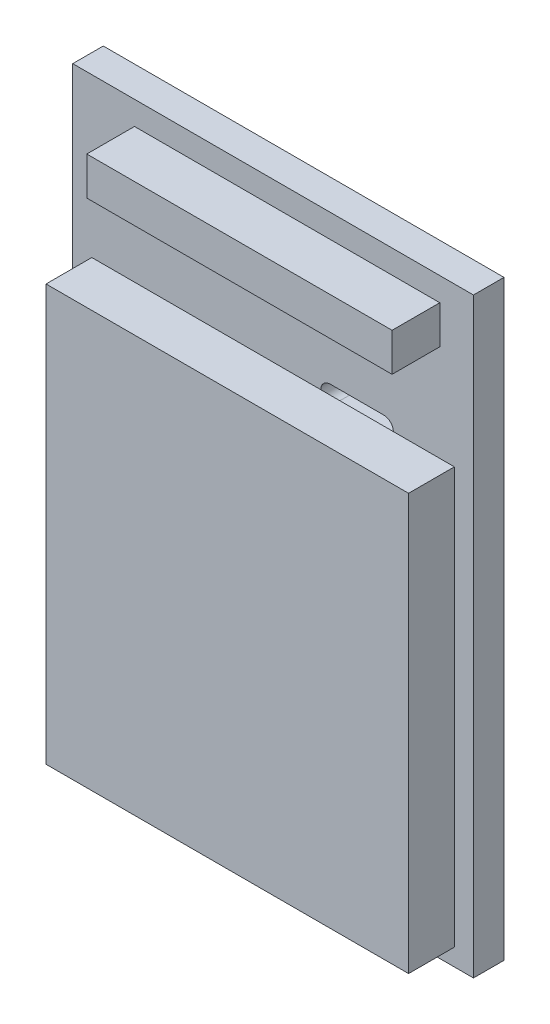
ISO-10303-21;
HEADER;
FILE_DESCRIPTION(('STEP AP214'),'2;1');
FILE_NAME('part.step','',(''),(''),'','','');
FILE_SCHEMA(('AUTOMOTIVE_DESIGN { 1 0 10303 214 1 1 1 1 }'));
ENDSEC;
DATA;
#1=APPLICATION_CONTEXT('core data for automotive mechanical design processes');
#2=APPLICATION_PROTOCOL_DEFINITION('international standard','automotive_design',2000,#1);
#3=PRODUCT_CONTEXT('',#1,'mechanical');
#4=PRODUCT('Part','Part','',(#3));
#5=PRODUCT_RELATED_PRODUCT_CATEGORY('part','',(#4));
#6=PRODUCT_DEFINITION_FORMATION('','',#4);
#7=PRODUCT_DEFINITION_CONTEXT('part definition',#1,'design');
#8=PRODUCT_DEFINITION('design','',#6,#7);
#9=PRODUCT_DEFINITION_SHAPE('','',#8);
#10=(LENGTH_UNIT() NAMED_UNIT(*) SI_UNIT(.MILLI.,.METRE.));
#11=(NAMED_UNIT(*) PLANE_ANGLE_UNIT() SI_UNIT($,.RADIAN.));
#12=(NAMED_UNIT(*) SI_UNIT($,.STERADIAN.) SOLID_ANGLE_UNIT());
#13=UNCERTAINTY_MEASURE_WITH_UNIT(LENGTH_MEASURE(1.E-05),#10,'distance_accuracy_value','');
#14=(GEOMETRIC_REPRESENTATION_CONTEXT(3) GLOBAL_UNCERTAINTY_ASSIGNED_CONTEXT((#13)) GLOBAL_UNIT_ASSIGNED_CONTEXT((#10,
#11,#12)) REPRESENTATION_CONTEXT('',''));
#15=CARTESIAN_POINT('',(0.,0.,0.));
#16=DIRECTION('',(0.,0.,1.));
#17=DIRECTION('',(1.,0.,0.));
#18=AXIS2_PLACEMENT_3D('',#15,#16,#17);
#19=CARTESIAN_POINT('',(-4.75,3.6,0.8));
#20=DIRECTION('',(-1.,0.,0.));
#21=DIRECTION('',(0.,1.,0.));
#22=AXIS2_PLACEMENT_3D('',#19,#20,#21);
#23=PLANE('',#22);
#24=DIRECTION('',(0.,-1.,0.));
#25=VECTOR('',#24,1.);
#26=CARTESIAN_POINT('',(-4.75,3.6,0.8));
#27=LINE('',#26,#25);
#28=CARTESIAN_POINT('',(-4.75,3.6,0.8));
#29=VERTEX_POINT('',#28);
#30=CARTESIAN_POINT('',(-4.75,-7.3,0.8));
#31=VERTEX_POINT('',#30);
#32=EDGE_CURVE('P0_E11',#29,#31,#27,.T.);
#33=ORIENTED_EDGE('',*,*,#32,.T.);
#34=DIRECTION('',(0.,0.,1.));
#35=VECTOR('',#34,1.);
#36=CARTESIAN_POINT('',(-4.75,-7.3,0.8));
#37=LINE('',#36,#35);
#38=CARTESIAN_POINT('',(-4.75,-7.3,2.));
#39=VERTEX_POINT('',#38);
#40=EDGE_CURVE('P0_E28',#31,#39,#37,.T.);
#41=ORIENTED_EDGE('',*,*,#40,.T.);
#42=DIRECTION('',(0.,-1.,0.));
#43=VECTOR('',#42,1.);
#44=CARTESIAN_POINT('',(-4.75,3.6,2.));
#45=LINE('',#44,#43);
#46=CARTESIAN_POINT('',(-4.75,3.6,2.));
#47=VERTEX_POINT('',#46);
#48=EDGE_CURVE('P0_E84',#47,#39,#45,.T.);
#49=ORIENTED_EDGE('',*,*,#48,.F.);
#50=DIRECTION('',(0.,0.,1.));
#51=VECTOR('',#50,1.);
#52=CARTESIAN_POINT('',(-4.75,3.6,0.8));
#53=LINE('',#52,#51);
#54=EDGE_CURVE('P0_E95',#29,#47,#53,.T.);
#55=ORIENTED_EDGE('',*,*,#54,.F.);
#56=EDGE_LOOP('',(#33,#41,#49,#55));
#57=FACE_BOUND('',#56,.T.);
#58=ADVANCED_FACE('P0_F17',(#57),#23,.T.);
#59=CARTESIAN_POINT('',(4.75,3.6,0.8));
#60=DIRECTION('',(0.,1.,0.));
#61=DIRECTION('',(1.,0.,0.));
#62=AXIS2_PLACEMENT_3D('',#59,#60,#61);
#63=PLANE('',#62);
#64=DIRECTION('',(-1.,0.,0.));
#65=VECTOR('',#64,1.);
#66=CARTESIAN_POINT('',(4.75,3.6,0.8));
#67=LINE('',#66,#65);
#68=CARTESIAN_POINT('',(4.75,3.6,0.8));
#69=VERTEX_POINT('',#68);
#70=EDGE_CURVE('P0_E105',#69,#29,#67,.T.);
#71=ORIENTED_EDGE('',*,*,#70,.T.);
#72=ORIENTED_EDGE('',*,*,#54,.T.);
#73=DIRECTION('',(-1.,0.,0.));
#74=VECTOR('',#73,1.);
#75=CARTESIAN_POINT('',(4.75,3.6,2.));
#76=LINE('',#75,#74);
#77=CARTESIAN_POINT('',(4.75,3.6,2.));
#78=VERTEX_POINT('',#77);
#79=EDGE_CURVE('P0_E78',#78,#47,#76,.T.);
#80=ORIENTED_EDGE('',*,*,#79,.F.);
#81=DIRECTION('',(0.,0.,1.));
#82=VECTOR('',#81,1.);
#83=CARTESIAN_POINT('',(4.75,3.6,0.8));
#84=LINE('',#83,#82);
#85=EDGE_CURVE('P0_E72',#69,#78,#84,.T.);
#86=ORIENTED_EDGE('',*,*,#85,.F.);
#87=EDGE_LOOP('',(#71,#72,#80,#86));
#88=FACE_BOUND('',#87,.T.);
#89=ADVANCED_FACE('P0_F114',(#88),#63,.T.);
#90=CARTESIAN_POINT('',(4.75,-7.3,0.8));
#91=DIRECTION('',(1.,0.,0.));
#92=DIRECTION('',(0.,1.,0.));
#93=AXIS2_PLACEMENT_3D('',#90,#91,#92);
#94=PLANE('',#93);
#95=DIRECTION('',(0.,1.,0.));
#96=VECTOR('',#95,1.);
#97=CARTESIAN_POINT('',(4.75,-7.3,0.8));
#98=LINE('',#97,#96);
#99=CARTESIAN_POINT('',(4.75,-7.3,0.8));
#100=VERTEX_POINT('',#99);
#101=EDGE_CURVE('P0_E97',#100,#69,#98,.T.);
#102=ORIENTED_EDGE('',*,*,#101,.T.);
#103=ORIENTED_EDGE('',*,*,#85,.T.);
#104=DIRECTION('',(0.,1.,0.));
#105=VECTOR('',#104,1.);
#106=CARTESIAN_POINT('',(4.75,-7.3,2.));
#107=LINE('',#106,#105);
#108=CARTESIAN_POINT('',(4.75,-7.3,2.));
#109=VERTEX_POINT('',#108);
#110=EDGE_CURVE('P0_E67',#109,#78,#107,.T.);
#111=ORIENTED_EDGE('',*,*,#110,.F.);
#112=DIRECTION('',(0.,0.,1.));
#113=VECTOR('',#112,1.);
#114=CARTESIAN_POINT('',(4.75,-7.3,0.8));
#115=LINE('',#114,#113);
#116=EDGE_CURVE('P0_E21',#100,#109,#115,.T.);
#117=ORIENTED_EDGE('',*,*,#116,.F.);
#118=EDGE_LOOP('',(#102,#103,#111,#117));
#119=FACE_BOUND('',#118,.T.);
#120=ADVANCED_FACE('P0_F70',(#119),#94,.T.);
#121=CARTESIAN_POINT('',(-4.75,-7.3,0.8));
#122=DIRECTION('',(0.,-1.,0.));
#123=DIRECTION('',(0.,0.,-1.));
#124=AXIS2_PLACEMENT_3D('',#121,#122,#123);
#125=PLANE('',#124);
#126=DIRECTION('',(1.,0.,0.));
#127=VECTOR('',#126,1.);
#128=CARTESIAN_POINT('',(-4.75,-7.3,0.8));
#129=LINE('',#128,#127);
#130=EDGE_CURVE('P0_E82',#31,#100,#129,.T.);
#131=ORIENTED_EDGE('',*,*,#130,.T.);
#132=ORIENTED_EDGE('',*,*,#116,.T.);
#133=DIRECTION('',(1.,0.,0.));
#134=VECTOR('',#133,1.);
#135=CARTESIAN_POINT('',(-4.75,-7.3,2.));
#136=LINE('',#135,#134);
#137=EDGE_CURVE('P0_E77',#39,#109,#136,.T.);
#138=ORIENTED_EDGE('',*,*,#137,.F.);
#139=ORIENTED_EDGE('',*,*,#40,.F.);
#140=EDGE_LOOP('',(#131,#132,#138,#139));
#141=FACE_BOUND('',#140,.T.);
#142=ADVANCED_FACE('P0_F80',(#141),#125,.T.);
#143=CARTESIAN_POINT('',(0.,0.,2.));
#144=DIRECTION('',(0.,0.,1.));
#145=DIRECTION('',(1.,0.,0.));
#146=AXIS2_PLACEMENT_3D('',#143,#144,#145);
#147=PLANE('',#146);
#148=ORIENTED_EDGE('',*,*,#48,.T.);
#149=ORIENTED_EDGE('',*,*,#137,.T.);
#150=ORIENTED_EDGE('',*,*,#110,.T.);
#151=ORIENTED_EDGE('',*,*,#79,.T.);
#152=EDGE_LOOP('',(#148,#149,#150,#151));
#153=FACE_BOUND('',#152,.T.);
#154=ADVANCED_FACE('P0_F85',(#153),#147,.T.);
#155=CARTESIAN_POINT('',(0.,0.,0.8));
#156=DIRECTION('',(0.,0.,1.));
#157=DIRECTION('',(1.,0.,0.));
#158=AXIS2_PLACEMENT_3D('',#155,#156,#157);
#159=PLANE('',#158);
#160=ORIENTED_EDGE('',*,*,#70,.F.);
#161=ORIENTED_EDGE('',*,*,#101,.F.);
#162=ORIENTED_EDGE('',*,*,#130,.F.);
#163=ORIENTED_EDGE('',*,*,#32,.F.);
#164=EDGE_LOOP('',(#160,#161,#162,#163));
#165=FACE_BOUND('',#164,.T.);
#166=ADVANCED_FACE('P0_F19',(#165),#159,.F.);
#167=CLOSED_SHELL('',(#58,#89,#120,#142,#154,#166));
#168=MANIFOLD_SOLID_BREP('P0_B1',#167);
#169=CARTESIAN_POINT('',(0.,0.,2.05));
#170=DIRECTION('',(0.,0.,1.));
#171=DIRECTION('',(1.,0.,0.));
#172=AXIS2_PLACEMENT_3D('',#169,#170,#171);
#173=PLANE('',#172);
#174=DIRECTION('',(0.,-1.,0.));
#175=VECTOR('',#174,1.);
#176=CARTESIAN_POINT('',(-3.6319,7.1331,2.05));
#177=LINE('',#176,#175);
#178=CARTESIAN_POINT('',(-3.6319,7.1331,2.05));
#179=VERTEX_POINT('',#178);
#180=CARTESIAN_POINT('',(-3.6319,6.1331,2.05));
#181=VERTEX_POINT('',#180);
#182=EDGE_CURVE('P1_E11',#179,#181,#177,.T.);
#183=ORIENTED_EDGE('',*,*,#182,.T.);
#184=DIRECTION('',(1.,0.,0.));
#185=VECTOR('',#184,1.);
#186=CARTESIAN_POINT('',(-3.6319,6.1331,2.05));
#187=LINE('',#186,#185);
#188=CARTESIAN_POINT('',(4.3681,6.1331,2.05));
#189=VERTEX_POINT('',#188);
#190=EDGE_CURVE('P1_E29',#181,#189,#187,.T.);
#191=ORIENTED_EDGE('',*,*,#190,.T.);
#192=DIRECTION('',(0.,1.,0.));
#193=VECTOR('',#192,1.);
#194=CARTESIAN_POINT('',(4.3681,6.1331,2.05));
#195=LINE('',#194,#193);
#196=CARTESIAN_POINT('',(4.3681,7.1331,2.05));
#197=VERTEX_POINT('',#196);
#198=EDGE_CURVE('P1_E110',#189,#197,#195,.T.);
#199=ORIENTED_EDGE('',*,*,#198,.T.);
#200=DIRECTION('',(-1.,0.,0.));
#201=VECTOR('',#200,1.);
#202=CARTESIAN_POINT('',(4.3681,7.1331,2.05));
#203=LINE('',#202,#201);
#204=EDGE_CURVE('P1_E58',#197,#179,#203,.T.);
#205=ORIENTED_EDGE('',*,*,#204,.T.);
#206=EDGE_LOOP('',(#183,#191,#199,#205));
#207=FACE_BOUND('',#206,.T.);
#208=ADVANCED_FACE('P1_F18',(#207),#173,.T.);
#209=CARTESIAN_POINT('',(-3.6319,6.1331,0.8));
#210=DIRECTION('',(0.,-1.,0.));
#211=DIRECTION('',(0.,0.,-1.));
#212=AXIS2_PLACEMENT_3D('',#209,#210,#211);
#213=PLANE('',#212);
#214=DIRECTION('',(1.,0.,0.));
#215=VECTOR('',#214,1.);
#216=CARTESIAN_POINT('',(-3.6319,6.1331,0.8));
#217=LINE('',#216,#215);
#218=CARTESIAN_POINT('',(-3.6319,6.1331,0.8));
#219=VERTEX_POINT('',#218);
#220=CARTESIAN_POINT('',(4.3681,6.1331,0.8));
#221=VERTEX_POINT('',#220);
#222=EDGE_CURVE('P1_E101',#219,#221,#217,.T.);
#223=ORIENTED_EDGE('',*,*,#222,.T.);
#224=DIRECTION('',(0.,0.,1.));
#225=VECTOR('',#224,1.);
#226=CARTESIAN_POINT('',(4.3681,6.1331,0.8));
#227=LINE('',#226,#225);
#228=EDGE_CURVE('P1_E22',#221,#189,#227,.T.);
#229=ORIENTED_EDGE('',*,*,#228,.T.);
#230=ORIENTED_EDGE('',*,*,#190,.F.);
#231=DIRECTION('',(0.,0.,1.));
#232=VECTOR('',#231,1.);
#233=CARTESIAN_POINT('',(-3.6319,6.1331,0.8));
#234=LINE('',#233,#232);
#235=EDGE_CURVE('P1_E75',#219,#181,#234,.T.);
#236=ORIENTED_EDGE('',*,*,#235,.F.);
#237=EDGE_LOOP('',(#223,#229,#230,#236));
#238=FACE_BOUND('',#237,.T.);
#239=ADVANCED_FACE('P1_F20',(#238),#213,.T.);
#240=CARTESIAN_POINT('',(4.3681,6.1331,0.8));
#241=DIRECTION('',(1.,0.,0.));
#242=DIRECTION('',(0.,1.,0.));
#243=AXIS2_PLACEMENT_3D('',#240,#241,#242);
#244=PLANE('',#243);
#245=DIRECTION('',(0.,1.,0.));
#246=VECTOR('',#245,1.);
#247=CARTESIAN_POINT('',(4.3681,6.1331,0.8));
#248=LINE('',#247,#246);
#249=CARTESIAN_POINT('',(4.3681,7.1331,0.8));
#250=VERTEX_POINT('',#249);
#251=EDGE_CURVE('P1_E114',#221,#250,#248,.T.);
#252=ORIENTED_EDGE('',*,*,#251,.T.);
#253=DIRECTION('',(0.,0.,1.));
#254=VECTOR('',#253,1.);
#255=CARTESIAN_POINT('',(4.3681,7.1331,0.8));
#256=LINE('',#255,#254);
#257=EDGE_CURVE('P1_E80',#250,#197,#256,.T.);
#258=ORIENTED_EDGE('',*,*,#257,.T.);
#259=ORIENTED_EDGE('',*,*,#198,.F.);
#260=ORIENTED_EDGE('',*,*,#228,.F.);
#261=EDGE_LOOP('',(#252,#258,#259,#260));
#262=FACE_BOUND('',#261,.T.);
#263=ADVANCED_FACE('P1_F146',(#262),#244,.T.);
#264=CARTESIAN_POINT('',(4.3681,7.1331,0.8));
#265=DIRECTION('',(0.,1.,0.));
#266=DIRECTION('',(1.,0.,0.));
#267=AXIS2_PLACEMENT_3D('',#264,#265,#266);
#268=PLANE('',#267);
#269=DIRECTION('',(-1.,0.,0.));
#270=VECTOR('',#269,1.);
#271=CARTESIAN_POINT('',(4.3681,7.1331,0.8));
#272=LINE('',#271,#270);
#273=CARTESIAN_POINT('',(-3.6319,7.1331,0.8));
#274=VERTEX_POINT('',#273);
#275=EDGE_CURVE('P1_E92',#250,#274,#272,.T.);
#276=ORIENTED_EDGE('',*,*,#275,.T.);
#277=DIRECTION('',(0.,0.,1.));
#278=VECTOR('',#277,1.);
#279=CARTESIAN_POINT('',(-3.6319,7.1331,0.8));
#280=LINE('',#279,#278);
#281=EDGE_CURVE('P1_E87',#274,#179,#280,.T.);
#282=ORIENTED_EDGE('',*,*,#281,.T.);
#283=ORIENTED_EDGE('',*,*,#204,.F.);
#284=ORIENTED_EDGE('',*,*,#257,.F.);
#285=EDGE_LOOP('',(#276,#282,#283,#284));
#286=FACE_BOUND('',#285,.T.);
#287=ADVANCED_FACE('P1_F95',(#286),#268,.T.);
#288=CARTESIAN_POINT('',(-3.6319,7.1331,0.8));
#289=DIRECTION('',(-1.,0.,0.));
#290=DIRECTION('',(0.,1.,0.));
#291=AXIS2_PLACEMENT_3D('',#288,#289,#290);
#292=PLANE('',#291);
#293=DIRECTION('',(0.,-1.,0.));
#294=VECTOR('',#293,1.);
#295=CARTESIAN_POINT('',(-3.6319,7.1331,0.8));
#296=LINE('',#295,#294);
#297=EDGE_CURVE('P1_E90',#274,#219,#296,.T.);
#298=ORIENTED_EDGE('',*,*,#297,.T.);
#299=ORIENTED_EDGE('',*,*,#235,.T.);
#300=ORIENTED_EDGE('',*,*,#182,.F.);
#301=ORIENTED_EDGE('',*,*,#281,.F.);
#302=EDGE_LOOP('',(#298,#299,#300,#301));
#303=FACE_BOUND('',#302,.T.);
#304=ADVANCED_FACE('P1_F88',(#303),#292,.T.);
#305=CARTESIAN_POINT('',(0.,0.,0.8));
#306=DIRECTION('',(0.,0.,1.));
#307=DIRECTION('',(1.,0.,0.));
#308=AXIS2_PLACEMENT_3D('',#305,#306,#307);
#309=PLANE('',#308);
#310=ORIENTED_EDGE('',*,*,#297,.F.);
#311=ORIENTED_EDGE('',*,*,#275,.F.);
#312=ORIENTED_EDGE('',*,*,#251,.F.);
#313=ORIENTED_EDGE('',*,*,#222,.F.);
#314=EDGE_LOOP('',(#310,#311,#312,#313));
#315=FACE_BOUND('',#314,.T.);
#316=ADVANCED_FACE('P1_F100',(#315),#309,.F.);
#317=CLOSED_SHELL('',(#208,#239,#263,#287,#304,#316));
#318=MANIFOLD_SOLID_BREP('P1_B1',#317);
#319=CARTESIAN_POINT('',(0.,0.,0.));
#320=DIRECTION('',(0.,0.,1.));
#321=DIRECTION('',(1.,0.,0.));
#322=AXIS2_PLACEMENT_3D('',#319,#320,#321);
#323=PLANE('',#322);
#324=DIRECTION('',(0.,-1.,0.));
#325=VECTOR('',#324,1.);
#326=CARTESIAN_POINT('',(-5.25,7.75,0.));
#327=LINE('',#326,#325);
#328=CARTESIAN_POINT('',(-5.25,7.75,0.));
#329=VERTEX_POINT('',#328);
#330=CARTESIAN_POINT('',(-5.25,-7.75,0.));
#331=VERTEX_POINT('',#330);
#332=EDGE_CURVE('P2_E124',#329,#331,#327,.T.);
#333=ORIENTED_EDGE('',*,*,#332,.F.);
#334=DIRECTION('',(-1.,0.,0.));
#335=VECTOR('',#334,1.);
#336=CARTESIAN_POINT('',(5.25,7.75,0.));
#337=LINE('',#336,#335);
#338=CARTESIAN_POINT('',(5.25,7.75,0.));
#339=VERTEX_POINT('',#338);
#340=EDGE_CURVE('P2_E42',#339,#329,#337,.T.);
#341=ORIENTED_EDGE('',*,*,#340,.F.);
#342=DIRECTION('',(0.,1.,0.));
#343=VECTOR('',#342,1.);
#344=CARTESIAN_POINT('',(5.25,-7.75,0.));
#345=LINE('',#344,#343);
#346=CARTESIAN_POINT('',(5.25,-7.75,0.));
#347=VERTEX_POINT('',#346);
#348=EDGE_CURVE('P2_E164',#347,#339,#345,.T.);
#349=ORIENTED_EDGE('',*,*,#348,.F.);
#350=DIRECTION('',(1.,0.,0.));
#351=VECTOR('',#350,1.);
#352=CARTESIAN_POINT('',(-5.25,-7.75,0.));
#353=LINE('',#352,#351);
#354=EDGE_CURVE('P2_E155',#331,#347,#353,.T.);
#355=ORIENTED_EDGE('',*,*,#354,.F.);
#356=EDGE_LOOP('',(#333,#341,#349,#355));
#357=FACE_BOUND('',#356,.T.);
#358=CARTESIAN_POINT('',(1.5,3.6,0.));
#359=DIRECTION('',(0.,0.,1.));
#360=DIRECTION('',(0.,1.,0.));
#361=AXIS2_PLACEMENT_3D('',#358,#359,#360);
#362=CIRCLE('',#361,0.25);
#363=CARTESIAN_POINT('',(1.5,3.85,0.));
#364=VERTEX_POINT('',#363);
#365=CARTESIAN_POINT('',(1.5,3.35,0.));
#366=VERTEX_POINT('',#365);
#367=EDGE_CURVE('P2_E11',#364,#366,#362,.T.);
#368=ORIENTED_EDGE('',*,*,#367,.T.);
#369=DIRECTION('',(1.,0.,0.));
#370=VECTOR('',#369,1.);
#371=CARTESIAN_POINT('',(1.5,3.35,0.));
#372=LINE('',#371,#370);
#373=CARTESIAN_POINT('',(2.9,3.35,0.));
#374=VERTEX_POINT('',#373);
#375=EDGE_CURVE('P2_E28',#366,#374,#372,.T.);
#376=ORIENTED_EDGE('',*,*,#375,.T.);
#377=CARTESIAN_POINT('',(2.9,3.6,0.));
#378=DIRECTION('',(0.,0.,1.));
#379=DIRECTION('',(0.,-1.,0.));
#380=AXIS2_PLACEMENT_3D('',#377,#378,#379);
#381=CIRCLE('',#380,0.25);
#382=CARTESIAN_POINT('',(2.9,3.85,0.));
#383=VERTEX_POINT('',#382);
#384=EDGE_CURVE('P2_E123',#374,#383,#381,.T.);
#385=ORIENTED_EDGE('',*,*,#384,.T.);
#386=DIRECTION('',(-1.,0.,0.));
#387=VECTOR('',#386,1.);
#388=CARTESIAN_POINT('',(2.9,3.85,0.));
#389=LINE('',#388,#387);
#390=EDGE_CURVE('P2_E113',#383,#364,#389,.T.);
#391=ORIENTED_EDGE('',*,*,#390,.T.);
#392=EDGE_LOOP('',(#368,#376,#385,#391));
#393=FACE_BOUND('',#392,.T.);
#394=ADVANCED_FACE('P2_F17',(#357,#393),#323,.F.);
#395=CARTESIAN_POINT('',(-5.25,7.75,0.));
#396=DIRECTION('',(-1.,0.,0.));
#397=DIRECTION('',(0.,1.,0.));
#398=AXIS2_PLACEMENT_3D('',#395,#396,#397);
#399=PLANE('',#398);
#400=ORIENTED_EDGE('',*,*,#332,.T.);
#401=DIRECTION('',(0.,0.,1.));
#402=VECTOR('',#401,1.);
#403=CARTESIAN_POINT('',(-5.25,-7.75,0.));
#404=LINE('',#403,#402);
#405=CARTESIAN_POINT('',(-5.25,-7.75,0.8));
#406=VERTEX_POINT('',#405);
#407=EDGE_CURVE('P2_E150',#331,#406,#404,.T.);
#408=ORIENTED_EDGE('',*,*,#407,.T.);
#409=DIRECTION('',(0.,-1.,0.));
#410=VECTOR('',#409,1.);
#411=CARTESIAN_POINT('',(-5.25,7.75,0.8));
#412=LINE('',#411,#410);
#413=CARTESIAN_POINT('',(-5.25,7.75,0.8));
#414=VERTEX_POINT('',#413);
#415=EDGE_CURVE('P2_E167',#414,#406,#412,.T.);
#416=ORIENTED_EDGE('',*,*,#415,.F.);
#417=DIRECTION('',(0.,0.,1.));
#418=VECTOR('',#417,1.);
#419=CARTESIAN_POINT('',(-5.25,7.75,0.));
#420=LINE('',#419,#418);
#421=EDGE_CURVE('P2_E178',#329,#414,#420,.T.);
#422=ORIENTED_EDGE('',*,*,#421,.F.);
#423=EDGE_LOOP('',(#400,#408,#416,#422));
#424=FACE_BOUND('',#423,.T.);
#425=ADVANCED_FACE('P2_F214',(#424),#399,.T.);
#426=CARTESIAN_POINT('',(5.25,7.75,0.));
#427=DIRECTION('',(0.,1.,0.));
#428=DIRECTION('',(1.,0.,0.));
#429=AXIS2_PLACEMENT_3D('',#426,#427,#428);
#430=PLANE('',#429);
#431=ORIENTED_EDGE('',*,*,#340,.T.);
#432=ORIENTED_EDGE('',*,*,#421,.T.);
#433=DIRECTION('',(-1.,0.,0.));
#434=VECTOR('',#433,1.);
#435=CARTESIAN_POINT('',(5.25,7.75,0.8));
#436=LINE('',#435,#434);
#437=CARTESIAN_POINT('',(5.25,7.75,0.8));
#438=VERTEX_POINT('',#437);
#439=EDGE_CURVE('P2_E60',#438,#414,#436,.T.);
#440=ORIENTED_EDGE('',*,*,#439,.F.);
#441=DIRECTION('',(0.,0.,1.));
#442=VECTOR('',#441,1.);
#443=CARTESIAN_POINT('',(5.25,7.75,0.));
#444=LINE('',#443,#442);
#445=EDGE_CURVE('P2_E157',#339,#438,#444,.T.);
#446=ORIENTED_EDGE('',*,*,#445,.F.);
#447=EDGE_LOOP('',(#431,#432,#440,#446));
#448=FACE_BOUND('',#447,.T.);
#449=ADVANCED_FACE('P2_F19',(#448),#430,.T.);
#450=CARTESIAN_POINT('',(5.25,-7.75,0.));
#451=DIRECTION('',(1.,0.,0.));
#452=DIRECTION('',(0.,1.,0.));
#453=AXIS2_PLACEMENT_3D('',#450,#451,#452);
#454=PLANE('',#453);
#455=ORIENTED_EDGE('',*,*,#348,.T.);
#456=ORIENTED_EDGE('',*,*,#445,.T.);
#457=DIRECTION('',(0.,1.,0.));
#458=VECTOR('',#457,1.);
#459=CARTESIAN_POINT('',(5.25,-7.75,0.8));
#460=LINE('',#459,#458);
#461=CARTESIAN_POINT('',(5.25,-7.75,0.8));
#462=VERTEX_POINT('',#461);
#463=EDGE_CURVE('P2_E72',#462,#438,#460,.T.);
#464=ORIENTED_EDGE('',*,*,#463,.F.);
#465=DIRECTION('',(0.,0.,1.));
#466=VECTOR('',#465,1.);
#467=CARTESIAN_POINT('',(5.25,-7.75,0.));
#468=LINE('',#467,#466);
#469=EDGE_CURVE('P2_E158',#347,#462,#468,.T.);
#470=ORIENTED_EDGE('',*,*,#469,.F.);
#471=EDGE_LOOP('',(#455,#456,#464,#470));
#472=FACE_BOUND('',#471,.T.);
#473=ADVANCED_FACE('P2_F252',(#472),#454,.T.);
#474=CARTESIAN_POINT('',(-5.25,-7.75,0.));
#475=DIRECTION('',(0.,-1.,0.));
#476=DIRECTION('',(0.,0.,-1.));
#477=AXIS2_PLACEMENT_3D('',#474,#475,#476);
#478=PLANE('',#477);
#479=ORIENTED_EDGE('',*,*,#354,.T.);
#480=ORIENTED_EDGE('',*,*,#469,.T.);
#481=DIRECTION('',(1.,0.,0.));
#482=VECTOR('',#481,1.);
#483=CARTESIAN_POINT('',(-5.25,-7.75,0.8));
#484=LINE('',#483,#482);
#485=EDGE_CURVE('P2_E174',#406,#462,#484,.T.);
#486=ORIENTED_EDGE('',*,*,#485,.F.);
#487=ORIENTED_EDGE('',*,*,#407,.F.);
#488=EDGE_LOOP('',(#479,#480,#486,#487));
#489=FACE_BOUND('',#488,.T.);
#490=ADVANCED_FACE('P2_F230',(#489),#478,.T.);
#491=CARTESIAN_POINT('',(0.,0.,0.8));
#492=DIRECTION('',(0.,0.,1.));
#493=DIRECTION('',(1.,0.,0.));
#494=AXIS2_PLACEMENT_3D('',#491,#492,#493);
#495=PLANE('',#494);
#496=ORIENTED_EDGE('',*,*,#415,.T.);
#497=ORIENTED_EDGE('',*,*,#485,.T.);
#498=ORIENTED_EDGE('',*,*,#463,.T.);
#499=ORIENTED_EDGE('',*,*,#439,.T.);
#500=EDGE_LOOP('',(#496,#497,#498,#499));
#501=FACE_BOUND('',#500,.T.);
#502=CARTESIAN_POINT('',(1.5,3.6,0.8));
#503=DIRECTION('',(0.,0.,1.));
#504=DIRECTION('',(0.,1.,0.));
#505=AXIS2_PLACEMENT_3D('',#502,#503,#504);
#506=CIRCLE('',#505,0.25);
#507=CARTESIAN_POINT('',(1.5,3.85,0.8));
#508=VERTEX_POINT('',#507);
#509=CARTESIAN_POINT('',(1.5,3.35,0.8));
#510=VERTEX_POINT('',#509);
#511=EDGE_CURVE('P2_E151',#508,#510,#506,.T.);
#512=ORIENTED_EDGE('',*,*,#511,.F.);
#513=DIRECTION('',(-1.,0.,0.));
#514=VECTOR('',#513,1.);
#515=CARTESIAN_POINT('',(2.9,3.85,0.8));
#516=LINE('',#515,#514);
#517=CARTESIAN_POINT('',(2.9,3.85,0.8));
#518=VERTEX_POINT('',#517);
#519=EDGE_CURVE('P2_E181',#518,#508,#516,.T.);
#520=ORIENTED_EDGE('',*,*,#519,.F.);
#521=CARTESIAN_POINT('',(2.9,3.6,0.8));
#522=DIRECTION('',(0.,0.,1.));
#523=DIRECTION('',(0.,-1.,0.));
#524=AXIS2_PLACEMENT_3D('',#521,#522,#523);
#525=CIRCLE('',#524,0.25);
#526=CARTESIAN_POINT('',(2.9,3.35,0.8));
#527=VERTEX_POINT('',#526);
#528=EDGE_CURVE('P2_E133',#527,#518,#525,.T.);
#529=ORIENTED_EDGE('',*,*,#528,.F.);
#530=DIRECTION('',(1.,0.,0.));
#531=VECTOR('',#530,1.);
#532=CARTESIAN_POINT('',(1.5,3.35,0.8));
#533=LINE('',#532,#531);
#534=EDGE_CURVE('P2_E136',#510,#527,#533,.T.);
#535=ORIENTED_EDGE('',*,*,#534,.F.);
#536=EDGE_LOOP('',(#512,#520,#529,#535));
#537=FACE_BOUND('',#536,.T.);
#538=ADVANCED_FACE('P2_F205',(#501,#537),#495,.T.);
#539=CARTESIAN_POINT('',(1.5,3.6,0.8));
#540=DIRECTION('',(0.,0.,1.));
#541=DIRECTION('',(-1.,0.,0.));
#542=AXIS2_PLACEMENT_3D('',#539,#540,#541);
#543=CYLINDRICAL_SURFACE('',#542,0.25);
#544=ORIENTED_EDGE('',*,*,#511,.T.);
#545=DIRECTION('',(0.,0.,-1.));
#546=VECTOR('',#545,1.);
#547=CARTESIAN_POINT('',(1.5,3.35,0.8));
#548=LINE('',#547,#546);
#549=EDGE_CURVE('P2_E21',#510,#366,#548,.T.);
#550=ORIENTED_EDGE('',*,*,#549,.T.);
#551=ORIENTED_EDGE('',*,*,#367,.F.);
#552=DIRECTION('',(0.,0.,-1.));
#553=VECTOR('',#552,1.);
#554=CARTESIAN_POINT('',(1.5,3.85,0.8));
#555=LINE('',#554,#553);
#556=EDGE_CURVE('P2_E119',#508,#364,#555,.T.);
#557=ORIENTED_EDGE('',*,*,#556,.F.);
#558=EDGE_LOOP('',(#544,#550,#551,#557));
#559=FACE_BOUND('',#558,.T.);
#560=ADVANCED_FACE('P2_F207',(#559),#543,.F.);
#561=CARTESIAN_POINT('',(2.9,3.85,0.8));
#562=DIRECTION('',(0.,1.,0.));
#563=DIRECTION('',(1.,0.,0.));
#564=AXIS2_PLACEMENT_3D('',#561,#562,#563);
#565=PLANE('',#564);
#566=ORIENTED_EDGE('',*,*,#390,.F.);
#567=DIRECTION('',(0.,0.,-1.));
#568=VECTOR('',#567,1.);
#569=CARTESIAN_POINT('',(2.9,3.85,0.8));
#570=LINE('',#569,#568);
#571=EDGE_CURVE('P2_E117',#518,#383,#570,.T.);
#572=ORIENTED_EDGE('',*,*,#571,.F.);
#573=ORIENTED_EDGE('',*,*,#519,.T.);
#574=ORIENTED_EDGE('',*,*,#556,.T.);
#575=EDGE_LOOP('',(#566,#572,#573,#574));
#576=FACE_BOUND('',#575,.T.);
#577=ADVANCED_FACE('P2_F115',(#576),#565,.F.);
#578=CARTESIAN_POINT('',(2.9,3.6,0.8));
#579=DIRECTION('',(0.,0.,1.));
#580=DIRECTION('',(1.,0.,0.));
#581=AXIS2_PLACEMENT_3D('',#578,#579,#580);
#582=CYLINDRICAL_SURFACE('',#581,0.25);
#583=ORIENTED_EDGE('',*,*,#528,.T.);
#584=ORIENTED_EDGE('',*,*,#571,.T.);
#585=ORIENTED_EDGE('',*,*,#384,.F.);
#586=DIRECTION('',(0.,0.,-1.));
#587=VECTOR('',#586,1.);
#588=CARTESIAN_POINT('',(2.9,3.35,0.8));
#589=LINE('',#588,#587);
#590=EDGE_CURVE('P2_E144',#527,#374,#589,.T.);
#591=ORIENTED_EDGE('',*,*,#590,.F.);
#592=EDGE_LOOP('',(#583,#584,#585,#591));
#593=FACE_BOUND('',#592,.T.);
#594=ADVANCED_FACE('P2_F131',(#593),#582,.F.);
#595=CARTESIAN_POINT('',(1.5,3.35,0.8));
#596=DIRECTION('',(0.,-1.,0.));
#597=DIRECTION('',(0.,0.,-1.));
#598=AXIS2_PLACEMENT_3D('',#595,#596,#597);
#599=PLANE('',#598);
#600=ORIENTED_EDGE('',*,*,#534,.T.);
#601=ORIENTED_EDGE('',*,*,#590,.T.);
#602=ORIENTED_EDGE('',*,*,#375,.F.);
#603=ORIENTED_EDGE('',*,*,#549,.F.);
#604=EDGE_LOOP('',(#600,#601,#602,#603));
#605=FACE_BOUND('',#604,.T.);
#606=ADVANCED_FACE('P2_F200',(#605),#599,.F.);
#607=CLOSED_SHELL('',(#394,#425,#449,#473,#490,#538,#560,#577,#594,#606));
#608=MANIFOLD_SOLID_BREP('P2_B1',#607);
#609=ADVANCED_BREP_SHAPE_REPRESENTATION('',(#18,#168,#318,#608),#14);
#610=SHAPE_DEFINITION_REPRESENTATION(#9,#609);
ENDSEC;
END-ISO-10303-21;
